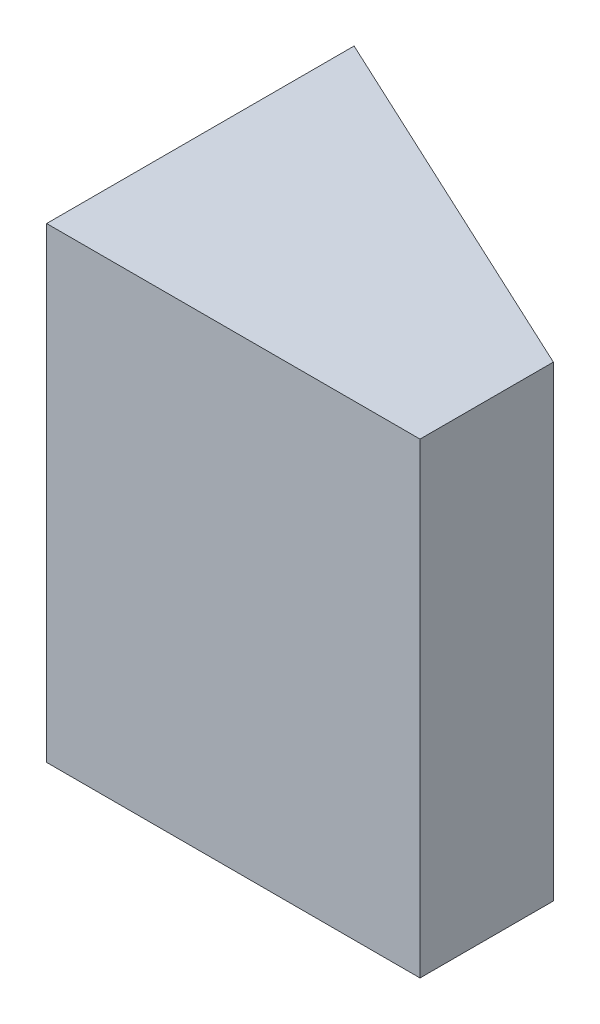
ISO-10303-21;
HEADER;
FILE_DESCRIPTION(('STEP AP214'),'2;1');
FILE_NAME('part.step','',(''),(''),'','','');
FILE_SCHEMA(('AUTOMOTIVE_DESIGN { 1 0 10303 214 1 1 1 1 }'));
ENDSEC;
DATA;
#1=APPLICATION_CONTEXT('core data for automotive mechanical design processes');
#2=APPLICATION_PROTOCOL_DEFINITION('international standard','automotive_design',2000,#1);
#3=PRODUCT_CONTEXT('',#1,'mechanical');
#4=PRODUCT('Part','Part','',(#3));
#5=PRODUCT_RELATED_PRODUCT_CATEGORY('part','',(#4));
#6=PRODUCT_DEFINITION_FORMATION('','',#4);
#7=PRODUCT_DEFINITION_CONTEXT('part definition',#1,'design');
#8=PRODUCT_DEFINITION('design','',#6,#7);
#9=PRODUCT_DEFINITION_SHAPE('','',#8);
#10=(LENGTH_UNIT() NAMED_UNIT(*) SI_UNIT(.MILLI.,.METRE.));
#11=(NAMED_UNIT(*) PLANE_ANGLE_UNIT() SI_UNIT($,.RADIAN.));
#12=(NAMED_UNIT(*) SI_UNIT($,.STERADIAN.) SOLID_ANGLE_UNIT());
#13=UNCERTAINTY_MEASURE_WITH_UNIT(LENGTH_MEASURE(1.E-05),#10,'distance_accuracy_value','');
#14=(GEOMETRIC_REPRESENTATION_CONTEXT(3) GLOBAL_UNCERTAINTY_ASSIGNED_CONTEXT((#13)) GLOBAL_UNIT_ASSIGNED_CONTEXT((#10,
#11,#12)) REPRESENTATION_CONTEXT('',''));
#15=CARTESIAN_POINT('',(0.,0.,0.));
#16=DIRECTION('',(0.,0.,1.));
#17=DIRECTION('',(1.,0.,0.));
#18=AXIS2_PLACEMENT_3D('',#15,#16,#17);
#19=CARTESIAN_POINT('',(17.6623913599663,70.,-37.8771205041966));
#20=DIRECTION('',(-0.422618261740694,0.,0.906307787036653));
#21=DIRECTION('',(0.906307787036653,0.,0.422618261740694));
#22=AXIS2_PLACEMENT_3D('',#19,#20,#21);
#23=PLANE('',#22);
#24=DIRECTION('',(-0.906307787036653,0.,-0.422618261740694));
#25=VECTOR('',#24,1.);
#26=CARTESIAN_POINT('',(17.6623913599663,0.,-37.8771205041966));
#27=LINE('',#26,#25);
#28=CARTESIAN_POINT('',(56.,0.,-20.));
#29=VERTEX_POINT('',#28);
#30=CARTESIAN_POINT('',(0.,0.,-46.1132288566795));
#31=VERTEX_POINT('',#30);
#32=EDGE_CURVE('E98',#29,#31,#27,.T.);
#33=ORIENTED_EDGE('',*,*,#32,.T.);
#34=DIRECTION('',(0.,-1.,0.));
#35=VECTOR('',#34,1.);
#36=CARTESIAN_POINT('',(0.,70.,-46.1132288566795));
#37=LINE('',#36,#35);
#38=CARTESIAN_POINT('',(0.,70.,-46.1132288566795));
#39=VERTEX_POINT('',#38);
#40=EDGE_CURVE('E11',#39,#31,#37,.T.);
#41=ORIENTED_EDGE('',*,*,#40,.F.);
#42=DIRECTION('',(-0.906307787036653,0.,-0.422618261740694));
#43=VECTOR('',#42,1.);
#44=CARTESIAN_POINT('',(17.6623913599663,70.,-37.8771205041966));
#45=LINE('',#44,#43);
#46=CARTESIAN_POINT('',(56.,70.,-20.));
#47=VERTEX_POINT('',#46);
#48=EDGE_CURVE('E86',#47,#39,#45,.T.);
#49=ORIENTED_EDGE('',*,*,#48,.F.);
#50=DIRECTION('',(0.,-1.,0.));
#51=VECTOR('',#50,1.);
#52=CARTESIAN_POINT('',(56.,70.,-20.));
#53=LINE('',#52,#51);
#54=EDGE_CURVE('E94',#47,#29,#53,.T.);
#55=ORIENTED_EDGE('',*,*,#54,.T.);
#56=EDGE_LOOP('',(#33,#41,#49,#55));
#57=FACE_BOUND('',#56,.T.);
#58=ADVANCED_FACE('F35',(#57),#23,.F.);
#59=CARTESIAN_POINT('',(0.,70.,0.));
#60=DIRECTION('',(1.,0.,0.));
#61=DIRECTION('',(0.,0.,-1.));
#62=AXIS2_PLACEMENT_3D('',#59,#60,#61);
#63=PLANE('',#62);
#64=DIRECTION('',(0.,0.,1.));
#65=VECTOR('',#64,1.);
#66=CARTESIAN_POINT('',(0.,0.,0.));
#67=LINE('',#66,#65);
#68=CARTESIAN_POINT('',(0.,0.,0.));
#69=VERTEX_POINT('',#68);
#70=EDGE_CURVE('E90',#31,#69,#67,.T.);
#71=ORIENTED_EDGE('',*,*,#70,.T.);
#72=DIRECTION('',(0.,-1.,0.));
#73=VECTOR('',#72,1.);
#74=CARTESIAN_POINT('',(0.,70.,0.));
#75=LINE('',#74,#73);
#76=CARTESIAN_POINT('',(0.,70.,0.));
#77=VERTEX_POINT('',#76);
#78=EDGE_CURVE('E43',#77,#69,#75,.T.);
#79=ORIENTED_EDGE('',*,*,#78,.F.);
#80=DIRECTION('',(0.,0.,1.));
#81=VECTOR('',#80,1.);
#82=CARTESIAN_POINT('',(0.,70.,0.));
#83=LINE('',#82,#81);
#84=EDGE_CURVE('E81',#39,#77,#83,.T.);
#85=ORIENTED_EDGE('',*,*,#84,.F.);
#86=ORIENTED_EDGE('',*,*,#40,.T.);
#87=EDGE_LOOP('',(#71,#79,#85,#86));
#88=FACE_BOUND('',#87,.T.);
#89=ADVANCED_FACE('F89',(#88),#63,.F.);
#90=CARTESIAN_POINT('',(0.,70.,0.));
#91=DIRECTION('',(0.,0.,-1.));
#92=DIRECTION('',(-1.,0.,0.));
#93=AXIS2_PLACEMENT_3D('',#90,#91,#92);
#94=PLANE('',#93);
#95=DIRECTION('',(1.,0.,0.));
#96=VECTOR('',#95,1.);
#97=CARTESIAN_POINT('',(0.,0.,0.));
#98=LINE('',#97,#96);
#99=CARTESIAN_POINT('',(56.,0.,0.));
#100=VERTEX_POINT('',#99);
#101=EDGE_CURVE('E68',#69,#100,#98,.T.);
#102=ORIENTED_EDGE('',*,*,#101,.T.);
#103=DIRECTION('',(0.,-1.,0.));
#104=VECTOR('',#103,1.);
#105=CARTESIAN_POINT('',(56.,70.,0.));
#106=LINE('',#105,#104);
#107=CARTESIAN_POINT('',(56.,70.,0.));
#108=VERTEX_POINT('',#107);
#109=EDGE_CURVE('E91',#108,#100,#106,.T.);
#110=ORIENTED_EDGE('',*,*,#109,.F.);
#111=DIRECTION('',(1.,0.,0.));
#112=VECTOR('',#111,1.);
#113=CARTESIAN_POINT('',(0.,70.,0.));
#114=LINE('',#113,#112);
#115=EDGE_CURVE('E84',#77,#108,#114,.T.);
#116=ORIENTED_EDGE('',*,*,#115,.F.);
#117=ORIENTED_EDGE('',*,*,#78,.T.);
#118=EDGE_LOOP('',(#102,#110,#116,#117));
#119=FACE_BOUND('',#118,.T.);
#120=ADVANCED_FACE('F92',(#119),#94,.F.);
#121=CARTESIAN_POINT('',(56.,70.,0.));
#122=DIRECTION('',(-1.,0.,0.));
#123=DIRECTION('',(0.,0.,1.));
#124=AXIS2_PLACEMENT_3D('',#121,#122,#123);
#125=PLANE('',#124);
#126=DIRECTION('',(0.,0.,-1.));
#127=VECTOR('',#126,1.);
#128=CARTESIAN_POINT('',(56.,0.,0.));
#129=LINE('',#128,#127);
#130=EDGE_CURVE('E74',#100,#29,#129,.T.);
#131=ORIENTED_EDGE('',*,*,#130,.T.);
#132=ORIENTED_EDGE('',*,*,#54,.F.);
#133=DIRECTION('',(0.,0.,-1.));
#134=VECTOR('',#133,1.);
#135=CARTESIAN_POINT('',(56.,70.,0.));
#136=LINE('',#135,#134);
#137=EDGE_CURVE('E51',#108,#47,#136,.T.);
#138=ORIENTED_EDGE('',*,*,#137,.F.);
#139=ORIENTED_EDGE('',*,*,#109,.T.);
#140=EDGE_LOOP('',(#131,#132,#138,#139));
#141=FACE_BOUND('',#140,.T.);
#142=ADVANCED_FACE('F105',(#141),#125,.F.);
#143=CARTESIAN_POINT('',(0.,70.,0.));
#144=DIRECTION('',(0.,1.,0.));
#145=DIRECTION('',(0.,0.,1.));
#146=AXIS2_PLACEMENT_3D('',#143,#144,#145);
#147=PLANE('',#146);
#148=ORIENTED_EDGE('',*,*,#48,.T.);
#149=ORIENTED_EDGE('',*,*,#84,.T.);
#150=ORIENTED_EDGE('',*,*,#115,.T.);
#151=ORIENTED_EDGE('',*,*,#137,.T.);
#152=EDGE_LOOP('',(#148,#149,#150,#151));
#153=FACE_BOUND('',#152,.T.);
#154=ADVANCED_FACE('F82',(#153),#147,.T.);
#155=CARTESIAN_POINT('',(0.,0.,0.));
#156=DIRECTION('',(0.,1.,0.));
#157=DIRECTION('',(0.,0.,1.));
#158=AXIS2_PLACEMENT_3D('',#155,#156,#157);
#159=PLANE('',#158);
#160=ORIENTED_EDGE('',*,*,#32,.F.);
#161=ORIENTED_EDGE('',*,*,#130,.F.);
#162=ORIENTED_EDGE('',*,*,#101,.F.);
#163=ORIENTED_EDGE('',*,*,#70,.F.);
#164=EDGE_LOOP('',(#160,#161,#162,#163));
#165=FACE_BOUND('',#164,.T.);
#166=ADVANCED_FACE('F108',(#165),#159,.F.);
#167=CLOSED_SHELL('',(#58,#89,#120,#142,#154,#166));
#168=MANIFOLD_SOLID_BREP('B2',#167);
#169=ADVANCED_BREP_SHAPE_REPRESENTATION('',(#18,#168),#14);
#170=SHAPE_DEFINITION_REPRESENTATION(#9,#169);
ENDSEC;
END-ISO-10303-21;
